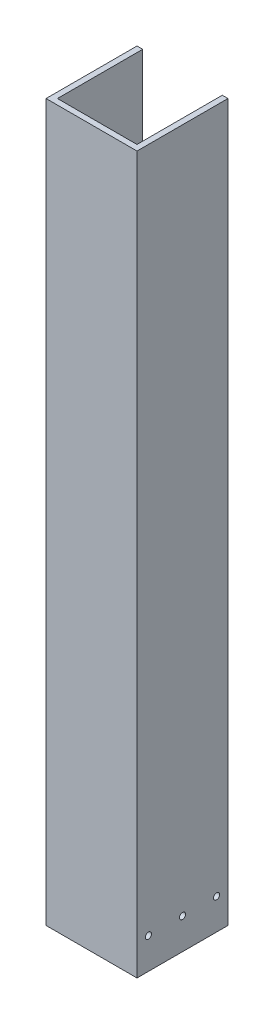
ISO-10303-21;
HEADER;
FILE_DESCRIPTION(('STEP AP214'),'2;1');
FILE_NAME('part.step','',(''),(''),'','','');
FILE_SCHEMA(('AUTOMOTIVE_DESIGN { 1 0 10303 214 1 1 1 1 }'));
ENDSEC;
DATA;
#1=APPLICATION_CONTEXT('core data for automotive mechanical design processes');
#2=APPLICATION_PROTOCOL_DEFINITION('international standard','automotive_design',2000,#1);
#3=PRODUCT_CONTEXT('',#1,'mechanical');
#4=PRODUCT('Part','Part','',(#3));
#5=PRODUCT_RELATED_PRODUCT_CATEGORY('part','',(#4));
#6=PRODUCT_DEFINITION_FORMATION('','',#4);
#7=PRODUCT_DEFINITION_CONTEXT('part definition',#1,'design');
#8=PRODUCT_DEFINITION('design','',#6,#7);
#9=PRODUCT_DEFINITION_SHAPE('','',#8);
#10=(LENGTH_UNIT() NAMED_UNIT(*) SI_UNIT(.MILLI.,.METRE.));
#11=(NAMED_UNIT(*) PLANE_ANGLE_UNIT() SI_UNIT($,.RADIAN.));
#12=(NAMED_UNIT(*) SI_UNIT($,.STERADIAN.) SOLID_ANGLE_UNIT());
#13=UNCERTAINTY_MEASURE_WITH_UNIT(LENGTH_MEASURE(1.E-05),#10,'distance_accuracy_value','');
#14=(GEOMETRIC_REPRESENTATION_CONTEXT(3) GLOBAL_UNCERTAINTY_ASSIGNED_CONTEXT((#13)) GLOBAL_UNIT_ASSIGNED_CONTEXT((#10,
#11,#12)) REPRESENTATION_CONTEXT('',''));
#15=CARTESIAN_POINT('',(0.,0.,0.));
#16=DIRECTION('',(0.,0.,1.));
#17=DIRECTION('',(1.,0.,0.));
#18=AXIS2_PLACEMENT_3D('',#15,#16,#17);
#19=CARTESIAN_POINT('',(3.175,400.,0.));
#20=DIRECTION('',(0.,0.,1.));
#21=DIRECTION('',(1.,0.,0.));
#22=AXIS2_PLACEMENT_3D('',#19,#20,#21);
#23=PLANE('',#22);
#24=DIRECTION('',(-1.,0.,0.));
#25=VECTOR('',#24,1.);
#26=CARTESIAN_POINT('',(3.175,0.,0.));
#27=LINE('',#26,#25);
#28=CARTESIAN_POINT('',(3.175,0.,0.));
#29=VERTEX_POINT('',#28);
#30=CARTESIAN_POINT('',(0.,0.,0.));
#31=VERTEX_POINT('',#30);
#32=EDGE_CURVE('E133',#29,#31,#27,.T.);
#33=ORIENTED_EDGE('',*,*,#32,.T.);
#34=DIRECTION('',(0.,-1.,0.));
#35=VECTOR('',#34,1.);
#36=CARTESIAN_POINT('',(0.,400.,0.));
#37=LINE('',#36,#35);
#38=CARTESIAN_POINT('',(0.,400.,0.));
#39=VERTEX_POINT('',#38);
#40=EDGE_CURVE('E11',#39,#31,#37,.T.);
#41=ORIENTED_EDGE('',*,*,#40,.F.);
#42=DIRECTION('',(-1.,0.,0.));
#43=VECTOR('',#42,1.);
#44=CARTESIAN_POINT('',(3.175,400.,0.));
#45=LINE('',#44,#43);
#46=CARTESIAN_POINT('',(3.175,400.,0.));
#47=VERTEX_POINT('',#46);
#48=EDGE_CURVE('E148',#47,#39,#45,.T.);
#49=ORIENTED_EDGE('',*,*,#48,.F.);
#50=DIRECTION('',(0.,-1.,0.));
#51=VECTOR('',#50,1.);
#52=CARTESIAN_POINT('',(3.175,400.,0.));
#53=LINE('',#52,#51);
#54=EDGE_CURVE('E129',#47,#29,#53,.T.);
#55=ORIENTED_EDGE('',*,*,#54,.T.);
#56=EDGE_LOOP('',(#33,#41,#49,#55));
#57=FACE_BOUND('',#56,.T.);
#58=ADVANCED_FACE('F35',(#57),#23,.F.);
#59=CARTESIAN_POINT('',(0.,400.,0.));
#60=DIRECTION('',(1.,0.,0.));
#61=DIRECTION('',(0.,0.,-1.));
#62=AXIS2_PLACEMENT_3D('',#59,#60,#61);
#63=PLANE('',#62);
#64=CARTESIAN_POINT('',(0.,17.3,44.45));
#65=DIRECTION('',(1.,0.,0.));
#66=DIRECTION('',(0.,0.,-1.));
#67=AXIS2_PLACEMENT_3D('',#64,#65,#66);
#68=CIRCLE('',#67,1.72719999999999);
#69=CARTESIAN_POINT('',(0.,17.3,42.7228));
#70=VERTEX_POINT('',#69);
#71=EDGE_CURVE('E322',#70,#70,#68,.T.);
#72=ORIENTED_EDGE('',*,*,#71,.T.);
#73=EDGE_LOOP('',(#72));
#74=FACE_BOUND('',#73,.T.);
#75=CARTESIAN_POINT('',(0.,17.3,25.4));
#76=DIRECTION('',(1.,0.,0.));
#77=DIRECTION('',(0.,0.,-1.));
#78=AXIS2_PLACEMENT_3D('',#75,#76,#77);
#79=CIRCLE('',#78,1.72719999999999);
#80=CARTESIAN_POINT('',(0.,17.3,23.6728));
#81=VERTEX_POINT('',#80);
#82=EDGE_CURVE('E166',#81,#81,#79,.T.);
#83=ORIENTED_EDGE('',*,*,#82,.T.);
#84=EDGE_LOOP('',(#83));
#85=FACE_BOUND('',#84,.T.);
#86=CARTESIAN_POINT('',(0.,17.3,6.34999999999999));
#87=DIRECTION('',(1.,0.,0.));
#88=DIRECTION('',(0.,0.,-1.));
#89=AXIS2_PLACEMENT_3D('',#86,#87,#88);
#90=CIRCLE('',#89,1.72719999999999);
#91=CARTESIAN_POINT('',(0.,17.3,4.6228));
#92=VERTEX_POINT('',#91);
#93=EDGE_CURVE('E162',#92,#92,#90,.T.);
#94=ORIENTED_EDGE('',*,*,#93,.T.);
#95=EDGE_LOOP('',(#94));
#96=FACE_BOUND('',#95,.T.);
#97=DIRECTION('',(0.,0.,1.));
#98=VECTOR('',#97,1.);
#99=CARTESIAN_POINT('',(0.,0.,0.));
#100=LINE('',#99,#98);
#101=CARTESIAN_POINT('',(0.,0.,50.8));
#102=VERTEX_POINT('',#101);
#103=EDGE_CURVE('E136',#31,#102,#100,.T.);
#104=ORIENTED_EDGE('',*,*,#103,.T.);
#105=DIRECTION('',(0.,-1.,0.));
#106=VECTOR('',#105,1.);
#107=CARTESIAN_POINT('',(0.,400.,50.8));
#108=LINE('',#107,#106);
#109=CARTESIAN_POINT('',(0.,400.,50.8));
#110=VERTEX_POINT('',#109);
#111=EDGE_CURVE('E44',#110,#102,#108,.T.);
#112=ORIENTED_EDGE('',*,*,#111,.F.);
#113=DIRECTION('',(0.,0.,1.));
#114=VECTOR('',#113,1.);
#115=CARTESIAN_POINT('',(0.,400.,0.));
#116=LINE('',#115,#114);
#117=EDGE_CURVE('E96',#39,#110,#116,.T.);
#118=ORIENTED_EDGE('',*,*,#117,.F.);
#119=ORIENTED_EDGE('',*,*,#40,.T.);
#120=EDGE_LOOP('',(#104,#112,#118,#119));
#121=FACE_BOUND('',#120,.T.);
#122=ADVANCED_FACE('F223',(#74,#85,#96,#121),#63,.F.);
#123=CARTESIAN_POINT('',(0.,400.,50.8));
#124=DIRECTION('',(0.,0.,-1.));
#125=DIRECTION('',(-1.,0.,0.));
#126=AXIS2_PLACEMENT_3D('',#123,#124,#125);
#127=PLANE('',#126);
#128=DIRECTION('',(1.,0.,0.));
#129=VECTOR('',#128,1.);
#130=CARTESIAN_POINT('',(0.,0.,50.8));
#131=LINE('',#130,#129);
#132=CARTESIAN_POINT('',(50.8,0.,50.8));
#133=VERTEX_POINT('',#132);
#134=EDGE_CURVE('E139',#102,#133,#131,.T.);
#135=ORIENTED_EDGE('',*,*,#134,.T.);
#136=DIRECTION('',(0.,-1.,0.));
#137=VECTOR('',#136,1.);
#138=CARTESIAN_POINT('',(50.8,400.,50.8));
#139=LINE('',#138,#137);
#140=CARTESIAN_POINT('',(50.8,400.,50.8));
#141=VERTEX_POINT('',#140);
#142=EDGE_CURVE('E155',#141,#133,#139,.T.);
#143=ORIENTED_EDGE('',*,*,#142,.F.);
#144=DIRECTION('',(1.,0.,0.));
#145=VECTOR('',#144,1.);
#146=CARTESIAN_POINT('',(0.,400.,50.8));
#147=LINE('',#146,#145);
#148=EDGE_CURVE('E190',#110,#141,#147,.T.);
#149=ORIENTED_EDGE('',*,*,#148,.F.);
#150=ORIENTED_EDGE('',*,*,#111,.T.);
#151=EDGE_LOOP('',(#135,#143,#149,#150));
#152=FACE_BOUND('',#151,.T.);
#153=ADVANCED_FACE('F227',(#152),#127,.F.);
#154=CARTESIAN_POINT('',(50.8,400.,50.8));
#155=DIRECTION('',(-1.,0.,0.));
#156=DIRECTION('',(0.,0.,1.));
#157=AXIS2_PLACEMENT_3D('',#154,#155,#156);
#158=PLANE('',#157);
#159=CARTESIAN_POINT('',(50.8,17.3,44.45));
#160=DIRECTION('',(1.,0.,0.));
#161=DIRECTION('',(0.,0.,-1.));
#162=AXIS2_PLACEMENT_3D('',#159,#160,#161);
#163=CIRCLE('',#162,1.72719999999999);
#164=CARTESIAN_POINT('',(50.8,17.3,42.7228));
#165=VERTEX_POINT('',#164);
#166=EDGE_CURVE('E321',#165,#165,#163,.T.);
#167=ORIENTED_EDGE('',*,*,#166,.F.);
#168=EDGE_LOOP('',(#167));
#169=FACE_BOUND('',#168,.T.);
#170=CARTESIAN_POINT('',(50.8,17.3,25.4));
#171=DIRECTION('',(1.,0.,0.));
#172=DIRECTION('',(0.,0.,-1.));
#173=AXIS2_PLACEMENT_3D('',#170,#171,#172);
#174=CIRCLE('',#173,1.72719999999999);
#175=CARTESIAN_POINT('',(50.8,17.3,23.6728));
#176=VERTEX_POINT('',#175);
#177=EDGE_CURVE('E173',#176,#176,#174,.T.);
#178=ORIENTED_EDGE('',*,*,#177,.F.);
#179=EDGE_LOOP('',(#178));
#180=FACE_BOUND('',#179,.T.);
#181=CARTESIAN_POINT('',(50.8,17.3,6.34999999999999));
#182=DIRECTION('',(1.,0.,0.));
#183=DIRECTION('',(0.,0.,-1.));
#184=AXIS2_PLACEMENT_3D('',#181,#182,#183);
#185=CIRCLE('',#184,1.72719999999999);
#186=CARTESIAN_POINT('',(50.8,17.3,4.62280000000001));
#187=VERTEX_POINT('',#186);
#188=EDGE_CURVE('E170',#187,#187,#185,.T.);
#189=ORIENTED_EDGE('',*,*,#188,.F.);
#190=EDGE_LOOP('',(#189));
#191=FACE_BOUND('',#190,.T.);
#192=DIRECTION('',(0.,0.,-1.));
#193=VECTOR('',#192,1.);
#194=CARTESIAN_POINT('',(50.8,0.,50.8));
#195=LINE('',#194,#193);
#196=CARTESIAN_POINT('',(50.8,0.,0.));
#197=VERTEX_POINT('',#196);
#198=EDGE_CURVE('E141',#133,#197,#195,.T.);
#199=ORIENTED_EDGE('',*,*,#198,.T.);
#200=DIRECTION('',(0.,-1.,0.));
#201=VECTOR('',#200,1.);
#202=CARTESIAN_POINT('',(50.8,400.,0.));
#203=LINE('',#202,#201);
#204=CARTESIAN_POINT('',(50.8,400.,0.));
#205=VERTEX_POINT('',#204);
#206=EDGE_CURVE('E152',#205,#197,#203,.T.);
#207=ORIENTED_EDGE('',*,*,#206,.F.);
#208=DIRECTION('',(0.,0.,-1.));
#209=VECTOR('',#208,1.);
#210=CARTESIAN_POINT('',(50.8,400.,50.8));
#211=LINE('',#210,#209);
#212=EDGE_CURVE('E192',#141,#205,#211,.T.);
#213=ORIENTED_EDGE('',*,*,#212,.F.);
#214=ORIENTED_EDGE('',*,*,#142,.T.);
#215=EDGE_LOOP('',(#199,#207,#213,#214));
#216=FACE_BOUND('',#215,.T.);
#217=ADVANCED_FACE('F198',(#169,#180,#191,#216),#158,.F.);
#218=CARTESIAN_POINT('',(50.8,400.,0.));
#219=DIRECTION('',(0.,0.,1.));
#220=DIRECTION('',(1.,0.,0.));
#221=AXIS2_PLACEMENT_3D('',#218,#219,#220);
#222=PLANE('',#221);
#223=DIRECTION('',(-1.,0.,0.));
#224=VECTOR('',#223,1.);
#225=CARTESIAN_POINT('',(50.8,0.,0.));
#226=LINE('',#225,#224);
#227=CARTESIAN_POINT('',(47.625,0.,0.));
#228=VERTEX_POINT('',#227);
#229=EDGE_CURVE('E143',#197,#228,#226,.T.);
#230=ORIENTED_EDGE('',*,*,#229,.T.);
#231=DIRECTION('',(0.,-1.,0.));
#232=VECTOR('',#231,1.);
#233=CARTESIAN_POINT('',(47.625,400.,0.));
#234=LINE('',#233,#232);
#235=CARTESIAN_POINT('',(47.625,400.,0.));
#236=VERTEX_POINT('',#235);
#237=EDGE_CURVE('E124',#236,#228,#234,.T.);
#238=ORIENTED_EDGE('',*,*,#237,.F.);
#239=DIRECTION('',(-1.,0.,0.));
#240=VECTOR('',#239,1.);
#241=CARTESIAN_POINT('',(50.8,400.,0.));
#242=LINE('',#241,#240);
#243=EDGE_CURVE('E115',#205,#236,#242,.T.);
#244=ORIENTED_EDGE('',*,*,#243,.F.);
#245=ORIENTED_EDGE('',*,*,#206,.T.);
#246=EDGE_LOOP('',(#230,#238,#244,#245));
#247=FACE_BOUND('',#246,.T.);
#248=ADVANCED_FACE('F202',(#247),#222,.F.);
#249=CARTESIAN_POINT('',(47.625,400.,0.));
#250=DIRECTION('',(1.,0.,0.));
#251=DIRECTION('',(0.,0.,-1.));
#252=AXIS2_PLACEMENT_3D('',#249,#250,#251);
#253=PLANE('',#252);
#254=CARTESIAN_POINT('',(47.625,17.3,44.45));
#255=DIRECTION('',(1.,0.,0.));
#256=DIRECTION('',(0.,0.,-1.));
#257=AXIS2_PLACEMENT_3D('',#254,#255,#256);
#258=CIRCLE('',#257,1.72719999999999);
#259=CARTESIAN_POINT('',(47.625,17.3,42.7228));
#260=VERTEX_POINT('',#259);
#261=EDGE_CURVE('E178',#260,#260,#258,.T.);
#262=ORIENTED_EDGE('',*,*,#261,.T.);
#263=EDGE_LOOP('',(#262));
#264=FACE_BOUND('',#263,.T.);
#265=CARTESIAN_POINT('',(47.625,17.3,25.4));
#266=DIRECTION('',(1.,0.,0.));
#267=DIRECTION('',(0.,0.,-1.));
#268=AXIS2_PLACEMENT_3D('',#265,#266,#267);
#269=CIRCLE('',#268,1.72719999999999);
#270=CARTESIAN_POINT('',(47.625,17.3,23.6728));
#271=VERTEX_POINT('',#270);
#272=EDGE_CURVE('E165',#271,#271,#269,.T.);
#273=ORIENTED_EDGE('',*,*,#272,.T.);
#274=EDGE_LOOP('',(#273));
#275=FACE_BOUND('',#274,.T.);
#276=CARTESIAN_POINT('',(47.625,17.3,6.34999999999999));
#277=DIRECTION('',(1.,0.,0.));
#278=DIRECTION('',(0.,0.,-1.));
#279=AXIS2_PLACEMENT_3D('',#276,#277,#278);
#280=CIRCLE('',#279,1.72719999999999);
#281=CARTESIAN_POINT('',(47.625,17.3,4.6228));
#282=VERTEX_POINT('',#281);
#283=EDGE_CURVE('E137',#282,#282,#280,.T.);
#284=ORIENTED_EDGE('',*,*,#283,.T.);
#285=EDGE_LOOP('',(#284));
#286=FACE_BOUND('',#285,.T.);
#287=DIRECTION('',(0.,0.,1.));
#288=VECTOR('',#287,1.);
#289=CARTESIAN_POINT('',(47.625,0.,0.));
#290=LINE('',#289,#288);
#291=CARTESIAN_POINT('',(47.625,0.,47.625));
#292=VERTEX_POINT('',#291);
#293=EDGE_CURVE('E123',#228,#292,#290,.T.);
#294=ORIENTED_EDGE('',*,*,#293,.T.);
#295=DIRECTION('',(0.,-1.,0.));
#296=VECTOR('',#295,1.);
#297=CARTESIAN_POINT('',(47.625,400.,47.625));
#298=LINE('',#297,#296);
#299=CARTESIAN_POINT('',(47.625,400.,47.625));
#300=VERTEX_POINT('',#299);
#301=EDGE_CURVE('E120',#300,#292,#298,.T.);
#302=ORIENTED_EDGE('',*,*,#301,.F.);
#303=DIRECTION('',(0.,0.,1.));
#304=VECTOR('',#303,1.);
#305=CARTESIAN_POINT('',(47.625,400.,0.));
#306=LINE('',#305,#304);
#307=EDGE_CURVE('E109',#236,#300,#306,.T.);
#308=ORIENTED_EDGE('',*,*,#307,.F.);
#309=ORIENTED_EDGE('',*,*,#237,.T.);
#310=EDGE_LOOP('',(#294,#302,#308,#309));
#311=FACE_BOUND('',#310,.T.);
#312=ADVANCED_FACE('F121',(#264,#275,#286,#311),#253,.F.);
#313=CARTESIAN_POINT('',(47.625,400.,47.625));
#314=DIRECTION('',(0.,0.,1.));
#315=DIRECTION('',(1.,0.,0.));
#316=AXIS2_PLACEMENT_3D('',#313,#314,#315);
#317=PLANE('',#316);
#318=DIRECTION('',(-1.,0.,0.));
#319=VECTOR('',#318,1.);
#320=CARTESIAN_POINT('',(47.625,0.,47.625));
#321=LINE('',#320,#319);
#322=CARTESIAN_POINT('',(3.175,0.,47.625));
#323=VERTEX_POINT('',#322);
#324=EDGE_CURVE('E82',#292,#323,#321,.T.);
#325=ORIENTED_EDGE('',*,*,#324,.T.);
#326=DIRECTION('',(0.,-1.,0.));
#327=VECTOR('',#326,1.);
#328=CARTESIAN_POINT('',(3.175,400.,47.625));
#329=LINE('',#328,#327);
#330=CARTESIAN_POINT('',(3.175,400.,47.625));
#331=VERTEX_POINT('',#330);
#332=EDGE_CURVE('E125',#331,#323,#329,.T.);
#333=ORIENTED_EDGE('',*,*,#332,.F.);
#334=DIRECTION('',(-1.,0.,0.));
#335=VECTOR('',#334,1.);
#336=CARTESIAN_POINT('',(47.625,400.,47.625));
#337=LINE('',#336,#335);
#338=EDGE_CURVE('E113',#300,#331,#337,.T.);
#339=ORIENTED_EDGE('',*,*,#338,.F.);
#340=ORIENTED_EDGE('',*,*,#301,.T.);
#341=EDGE_LOOP('',(#325,#333,#339,#340));
#342=FACE_BOUND('',#341,.T.);
#343=ADVANCED_FACE('F127',(#342),#317,.F.);
#344=CARTESIAN_POINT('',(3.175,400.,47.625));
#345=DIRECTION('',(-1.,0.,0.));
#346=DIRECTION('',(0.,0.,1.));
#347=AXIS2_PLACEMENT_3D('',#344,#345,#346);
#348=PLANE('',#347);
#349=CARTESIAN_POINT('',(3.175,17.3,44.45));
#350=DIRECTION('',(-1.,0.,0.));
#351=DIRECTION('',(0.,0.,1.));
#352=AXIS2_PLACEMENT_3D('',#349,#350,#351);
#353=CIRCLE('',#352,1.72719999999999);
#354=CARTESIAN_POINT('',(3.175,17.3,46.1772));
#355=VERTEX_POINT('',#354);
#356=EDGE_CURVE('E38',#355,#355,#353,.T.);
#357=ORIENTED_EDGE('',*,*,#356,.T.);
#358=EDGE_LOOP('',(#357));
#359=FACE_BOUND('',#358,.T.);
#360=CARTESIAN_POINT('',(3.175,17.3,25.4));
#361=DIRECTION('',(-1.,0.,0.));
#362=DIRECTION('',(0.,0.,1.));
#363=AXIS2_PLACEMENT_3D('',#360,#361,#362);
#364=CIRCLE('',#363,1.72719999999999);
#365=CARTESIAN_POINT('',(3.175,17.3,27.1272));
#366=VERTEX_POINT('',#365);
#367=EDGE_CURVE('E163',#366,#366,#364,.T.);
#368=ORIENTED_EDGE('',*,*,#367,.T.);
#369=EDGE_LOOP('',(#368));
#370=FACE_BOUND('',#369,.T.);
#371=CARTESIAN_POINT('',(3.175,17.3,6.34999999999999));
#372=DIRECTION('',(-1.,0.,0.));
#373=DIRECTION('',(0.,0.,1.));
#374=AXIS2_PLACEMENT_3D('',#371,#372,#373);
#375=CIRCLE('',#374,1.72719999999999);
#376=CARTESIAN_POINT('',(3.175,17.3,8.07719999999999));
#377=VERTEX_POINT('',#376);
#378=EDGE_CURVE('E160',#377,#377,#375,.T.);
#379=ORIENTED_EDGE('',*,*,#378,.T.);
#380=EDGE_LOOP('',(#379));
#381=FACE_BOUND('',#380,.T.);
#382=DIRECTION('',(0.,0.,-1.));
#383=VECTOR('',#382,1.);
#384=CARTESIAN_POINT('',(3.175,0.,47.625));
#385=LINE('',#384,#383);
#386=EDGE_CURVE('E88',#323,#29,#385,.T.);
#387=ORIENTED_EDGE('',*,*,#386,.T.);
#388=ORIENTED_EDGE('',*,*,#54,.F.);
#389=DIRECTION('',(0.,0.,-1.));
#390=VECTOR('',#389,1.);
#391=CARTESIAN_POINT('',(3.175,400.,47.625));
#392=LINE('',#391,#390);
#393=EDGE_CURVE('E53',#331,#47,#392,.T.);
#394=ORIENTED_EDGE('',*,*,#393,.F.);
#395=ORIENTED_EDGE('',*,*,#332,.T.);
#396=EDGE_LOOP('',(#387,#388,#394,#395));
#397=FACE_BOUND('',#396,.T.);
#398=ADVANCED_FACE('F210',(#359,#370,#381,#397),#348,.F.);
#399=CARTESIAN_POINT('',(0.,400.,0.));
#400=DIRECTION('',(0.,1.,0.));
#401=DIRECTION('',(0.,0.,1.));
#402=AXIS2_PLACEMENT_3D('',#399,#400,#401);
#403=PLANE('',#402);
#404=ORIENTED_EDGE('',*,*,#48,.T.);
#405=ORIENTED_EDGE('',*,*,#117,.T.);
#406=ORIENTED_EDGE('',*,*,#148,.T.);
#407=ORIENTED_EDGE('',*,*,#212,.T.);
#408=ORIENTED_EDGE('',*,*,#243,.T.);
#409=ORIENTED_EDGE('',*,*,#307,.T.);
#410=ORIENTED_EDGE('',*,*,#338,.T.);
#411=ORIENTED_EDGE('',*,*,#393,.T.);
#412=EDGE_LOOP('',(#404,#405,#406,#407,#408,#409,#410,#411));
#413=FACE_BOUND('',#412,.T.);
#414=ADVANCED_FACE('F111',(#413),#403,.T.);
#415=CARTESIAN_POINT('',(0.,0.,0.));
#416=DIRECTION('',(0.,1.,0.));
#417=DIRECTION('',(0.,0.,1.));
#418=AXIS2_PLACEMENT_3D('',#415,#416,#417);
#419=PLANE('',#418);
#420=ORIENTED_EDGE('',*,*,#32,.F.);
#421=ORIENTED_EDGE('',*,*,#386,.F.);
#422=ORIENTED_EDGE('',*,*,#324,.F.);
#423=ORIENTED_EDGE('',*,*,#293,.F.);
#424=ORIENTED_EDGE('',*,*,#229,.F.);
#425=ORIENTED_EDGE('',*,*,#198,.F.);
#426=ORIENTED_EDGE('',*,*,#134,.F.);
#427=ORIENTED_EDGE('',*,*,#103,.F.);
#428=EDGE_LOOP('',(#420,#421,#422,#423,#424,#425,#426,#427));
#429=FACE_BOUND('',#428,.T.);
#430=ADVANCED_FACE('F205',(#429),#419,.F.);
#431=CARTESIAN_POINT('',(50.8,17.3,6.34999999999999));
#432=DIRECTION('',(1.,0.,0.));
#433=DIRECTION('',(0.,0.,-1.));
#434=AXIS2_PLACEMENT_3D('',#431,#432,#433);
#435=CYLINDRICAL_SURFACE('',#434,1.72719999999999);
#436=ORIENTED_EDGE('',*,*,#93,.F.);
#437=EDGE_LOOP('',(#436));
#438=FACE_BOUND('',#437,.T.);
#439=ORIENTED_EDGE('',*,*,#378,.F.);
#440=EDGE_LOOP('',(#439));
#441=FACE_BOUND('',#440,.T.);
#442=ADVANCED_FACE('F255',(#438,#441),#435,.F.);
#443=ORIENTED_EDGE('',*,*,#188,.T.);
#444=EDGE_LOOP('',(#443));
#445=FACE_BOUND('',#444,.T.);
#446=ORIENTED_EDGE('',*,*,#283,.F.);
#447=EDGE_LOOP('',(#446));
#448=FACE_BOUND('',#447,.T.);
#449=ADVANCED_FACE('F252',(#445,#448),#435,.F.);
#450=CARTESIAN_POINT('',(50.8,17.3,25.4));
#451=DIRECTION('',(1.,0.,0.));
#452=DIRECTION('',(0.,0.,-1.));
#453=AXIS2_PLACEMENT_3D('',#450,#451,#452);
#454=CYLINDRICAL_SURFACE('',#453,1.72719999999999);
#455=ORIENTED_EDGE('',*,*,#82,.F.);
#456=EDGE_LOOP('',(#455));
#457=FACE_BOUND('',#456,.T.);
#458=ORIENTED_EDGE('',*,*,#367,.F.);
#459=EDGE_LOOP('',(#458));
#460=FACE_BOUND('',#459,.T.);
#461=ADVANCED_FACE('F254',(#457,#460),#454,.F.);
#462=ORIENTED_EDGE('',*,*,#177,.T.);
#463=EDGE_LOOP('',(#462));
#464=FACE_BOUND('',#463,.T.);
#465=ORIENTED_EDGE('',*,*,#272,.F.);
#466=EDGE_LOOP('',(#465));
#467=FACE_BOUND('',#466,.T.);
#468=ADVANCED_FACE('F262',(#464,#467),#454,.F.);
#469=CARTESIAN_POINT('',(50.8,17.3,44.45));
#470=DIRECTION('',(1.,0.,0.));
#471=DIRECTION('',(0.,0.,-1.));
#472=AXIS2_PLACEMENT_3D('',#469,#470,#471);
#473=CYLINDRICAL_SURFACE('',#472,1.72719999999999);
#474=ORIENTED_EDGE('',*,*,#71,.F.);
#475=EDGE_LOOP('',(#474));
#476=FACE_BOUND('',#475,.T.);
#477=ORIENTED_EDGE('',*,*,#356,.F.);
#478=EDGE_LOOP('',(#477));
#479=FACE_BOUND('',#478,.T.);
#480=ADVANCED_FACE('F297',(#476,#479),#473,.F.);
#481=ORIENTED_EDGE('',*,*,#166,.T.);
#482=EDGE_LOOP('',(#481));
#483=FACE_BOUND('',#482,.T.);
#484=ORIENTED_EDGE('',*,*,#261,.F.);
#485=EDGE_LOOP('',(#484));
#486=FACE_BOUND('',#485,.T.);
#487=ADVANCED_FACE('F306',(#483,#486),#473,.F.);
#488=CLOSED_SHELL('',(#58,#122,#153,#217,#248,#312,#343,#398,#414,#430,#442,#449,#461,#468,#480,#487));
#489=MANIFOLD_SOLID_BREP('B2',#488);
#490=ADVANCED_BREP_SHAPE_REPRESENTATION('',(#18,#489),#14);
#491=SHAPE_DEFINITION_REPRESENTATION(#9,#490);
ENDSEC;
END-ISO-10303-21;
